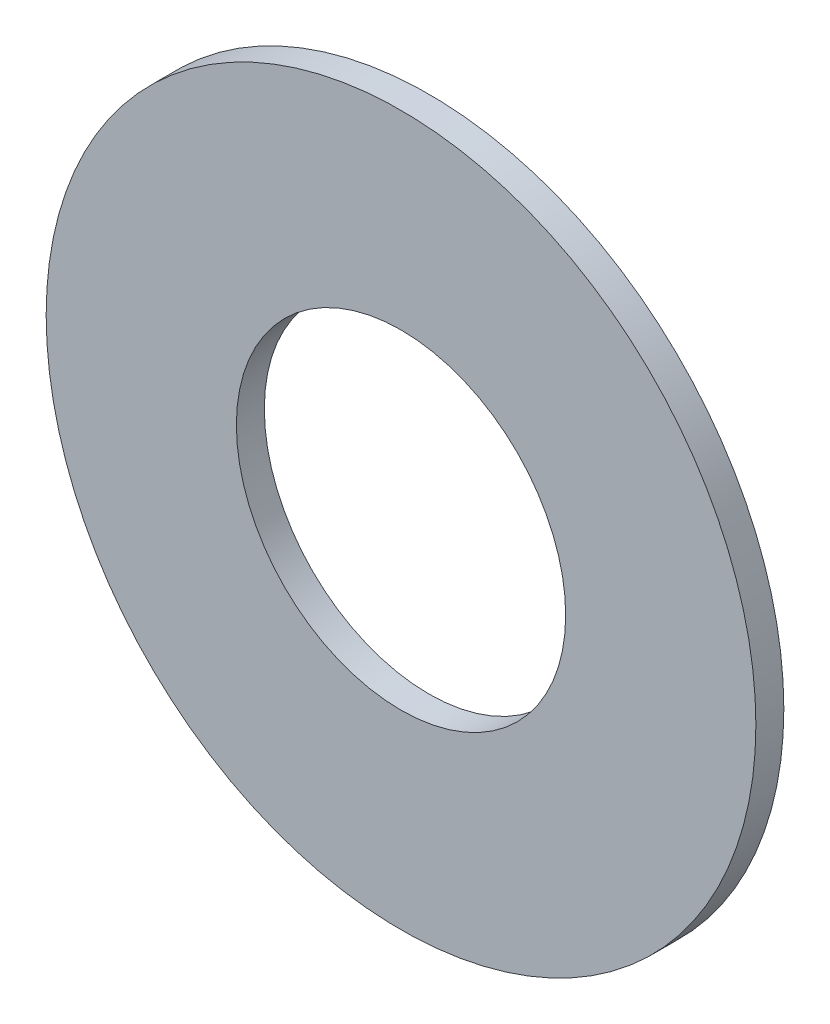
ISO-10303-21;
HEADER;
FILE_DESCRIPTION(('STEP AP214'),'2;1');
FILE_NAME('part.step','',(''),(''),'','','');
FILE_SCHEMA(('AUTOMOTIVE_DESIGN { 1 0 10303 214 1 1 1 1 }'));
ENDSEC;
DATA;
#1=APPLICATION_CONTEXT('core data for automotive mechanical design processes');
#2=APPLICATION_PROTOCOL_DEFINITION('international standard','automotive_design',2000,#1);
#3=PRODUCT_CONTEXT('',#1,'mechanical');
#4=PRODUCT('Part','Part','',(#3));
#5=PRODUCT_RELATED_PRODUCT_CATEGORY('part','',(#4));
#6=PRODUCT_DEFINITION_FORMATION('','',#4);
#7=PRODUCT_DEFINITION_CONTEXT('part definition',#1,'design');
#8=PRODUCT_DEFINITION('design','',#6,#7);
#9=PRODUCT_DEFINITION_SHAPE('','',#8);
#10=(LENGTH_UNIT() NAMED_UNIT(*) SI_UNIT(.MILLI.,.METRE.));
#11=(NAMED_UNIT(*) PLANE_ANGLE_UNIT() SI_UNIT($,.RADIAN.));
#12=(NAMED_UNIT(*) SI_UNIT($,.STERADIAN.) SOLID_ANGLE_UNIT());
#13=UNCERTAINTY_MEASURE_WITH_UNIT(LENGTH_MEASURE(1.E-05),#10,'distance_accuracy_value','');
#14=(GEOMETRIC_REPRESENTATION_CONTEXT(3) GLOBAL_UNCERTAINTY_ASSIGNED_CONTEXT((#13)) GLOBAL_UNIT_ASSIGNED_CONTEXT((#10,
#11,#12)) REPRESENTATION_CONTEXT('',''));
#15=CARTESIAN_POINT('',(0.,0.,0.));
#16=DIRECTION('',(0.,0.,1.));
#17=DIRECTION('',(1.,0.,0.));
#18=AXIS2_PLACEMENT_3D('',#15,#16,#17);
#19=CARTESIAN_POINT('',(0.,0.,-0.406399999999995));
#20=DIRECTION('',(0.,0.,1.));
#21=DIRECTION('',(1.,0.,0.));
#22=AXIS2_PLACEMENT_3D('',#19,#20,#21);
#23=CYLINDRICAL_SURFACE('',#22,10.31875);
#24=CARTESIAN_POINT('',(0.,0.,-0.406399999999995));
#25=DIRECTION('',(0.,0.,1.));
#26=DIRECTION('',(1.,0.,0.));
#27=AXIS2_PLACEMENT_3D('',#24,#25,#26);
#28=CIRCLE('',#27,10.31875);
#29=CARTESIAN_POINT('',(10.31875,0.,-0.406399999999995));
#30=VERTEX_POINT('',#29);
#31=EDGE_CURVE('E10',#30,#30,#28,.T.);
#32=ORIENTED_EDGE('',*,*,#31,.T.);
#33=EDGE_LOOP('',(#32));
#34=FACE_BOUND('',#33,.T.);
#35=CARTESIAN_POINT('',(0.,0.,0.406400000000005));
#36=DIRECTION('',(0.,0.,1.));
#37=DIRECTION('',(1.,0.,0.));
#38=AXIS2_PLACEMENT_3D('',#35,#36,#37);
#39=CIRCLE('',#38,10.31875);
#40=CARTESIAN_POINT('',(10.31875,0.,0.406400000000005));
#41=VERTEX_POINT('',#40);
#42=EDGE_CURVE('E42',#41,#41,#39,.T.);
#43=ORIENTED_EDGE('',*,*,#42,.F.);
#44=EDGE_LOOP('',(#43));
#45=FACE_BOUND('',#44,.T.);
#46=ADVANCED_FACE('F32',(#34,#45),#23,.T.);
#47=CARTESIAN_POINT('',(0.,0.,-0.406399999999995));
#48=DIRECTION('',(0.,0.,1.));
#49=DIRECTION('',(1.,0.,0.));
#50=AXIS2_PLACEMENT_3D('',#47,#48,#49);
#51=PLANE('',#50);
#52=CARTESIAN_POINT('',(0.,0.,-0.406399999999995));
#53=DIRECTION('',(0.,0.,1.));
#54=DIRECTION('',(1.,0.,0.));
#55=AXIS2_PLACEMENT_3D('',#52,#53,#54);
#56=CIRCLE('',#55,4.7879);
#57=CARTESIAN_POINT('',(4.7879,0.,-0.406399999999995));
#58=VERTEX_POINT('',#57);
#59=EDGE_CURVE('E38',#58,#58,#56,.T.);
#60=ORIENTED_EDGE('',*,*,#59,.T.);
#61=EDGE_LOOP('',(#60));
#62=FACE_BOUND('',#61,.T.);
#63=ORIENTED_EDGE('',*,*,#31,.F.);
#64=EDGE_LOOP('',(#63));
#65=FACE_BOUND('',#64,.T.);
#66=ADVANCED_FACE('F61',(#62,#65),#51,.F.);
#67=CARTESIAN_POINT('',(0.,0.,-0.406399999999995));
#68=DIRECTION('',(0.,0.,1.));
#69=DIRECTION('',(1.,0.,0.));
#70=AXIS2_PLACEMENT_3D('',#67,#68,#69);
#71=CYLINDRICAL_SURFACE('',#70,4.7879);
#72=ORIENTED_EDGE('',*,*,#59,.F.);
#73=EDGE_LOOP('',(#72));
#74=FACE_BOUND('',#73,.T.);
#75=CARTESIAN_POINT('',(0.,0.,0.406400000000005));
#76=DIRECTION('',(0.,0.,1.));
#77=DIRECTION('',(1.,0.,0.));
#78=AXIS2_PLACEMENT_3D('',#75,#76,#77);
#79=CIRCLE('',#78,4.7879);
#80=CARTESIAN_POINT('',(4.7879,0.,0.406400000000005));
#81=VERTEX_POINT('',#80);
#82=EDGE_CURVE('E46',#81,#81,#79,.T.);
#83=ORIENTED_EDGE('',*,*,#82,.T.);
#84=EDGE_LOOP('',(#83));
#85=FACE_BOUND('',#84,.T.);
#86=ADVANCED_FACE('F52',(#74,#85),#71,.F.);
#87=CARTESIAN_POINT('',(0.,0.,0.406400000000005));
#88=DIRECTION('',(0.,0.,1.));
#89=DIRECTION('',(1.,0.,0.));
#90=AXIS2_PLACEMENT_3D('',#87,#88,#89);
#91=PLANE('',#90);
#92=ORIENTED_EDGE('',*,*,#42,.T.);
#93=EDGE_LOOP('',(#92));
#94=FACE_BOUND('',#93,.T.);
#95=ORIENTED_EDGE('',*,*,#82,.F.);
#96=EDGE_LOOP('',(#95));
#97=FACE_BOUND('',#96,.T.);
#98=ADVANCED_FACE('F54',(#94,#97),#91,.T.);
#99=CLOSED_SHELL('',(#46,#66,#86,#98));
#100=MANIFOLD_SOLID_BREP('B2',#99);
#101=ADVANCED_BREP_SHAPE_REPRESENTATION('',(#18,#100),#14);
#102=SHAPE_DEFINITION_REPRESENTATION(#9,#101);
ENDSEC;
END-ISO-10303-21;
